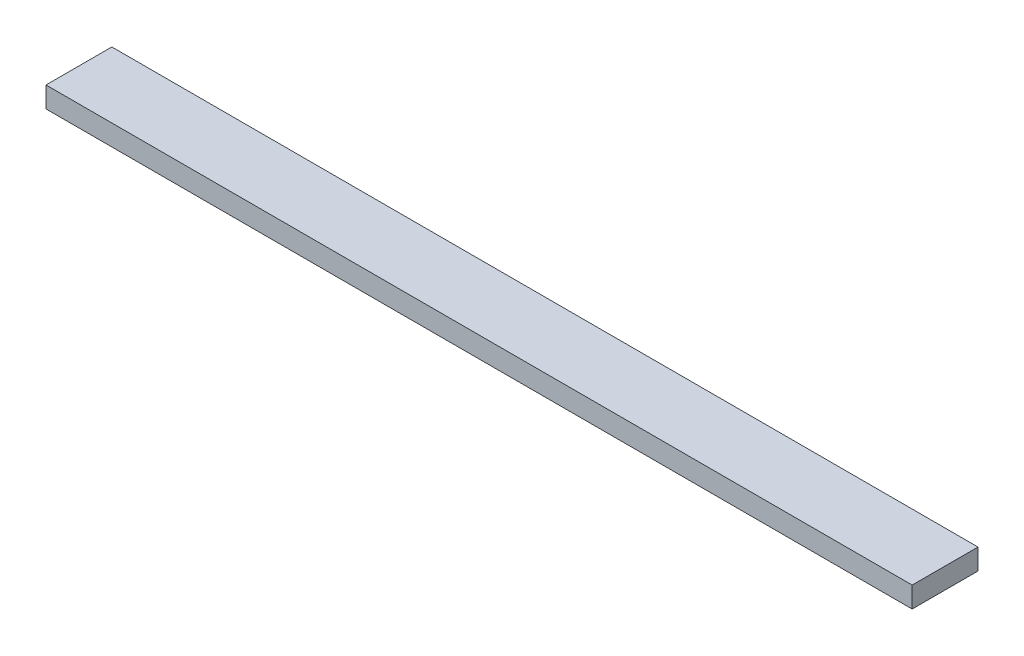
ISO-10303-21;
HEADER;
FILE_DESCRIPTION(('STEP AP214'),'2;1');
FILE_NAME('part.step','',(''),(''),'','','');
FILE_SCHEMA(('AUTOMOTIVE_DESIGN { 1 0 10303 214 1 1 1 1 }'));
ENDSEC;
DATA;
#1=APPLICATION_CONTEXT('core data for automotive mechanical design processes');
#2=APPLICATION_PROTOCOL_DEFINITION('international standard','automotive_design',2000,#1);
#3=PRODUCT_CONTEXT('',#1,'mechanical');
#4=PRODUCT('Part','Part','',(#3));
#5=PRODUCT_RELATED_PRODUCT_CATEGORY('part','',(#4));
#6=PRODUCT_DEFINITION_FORMATION('','',#4);
#7=PRODUCT_DEFINITION_CONTEXT('part definition',#1,'design');
#8=PRODUCT_DEFINITION('design','',#6,#7);
#9=PRODUCT_DEFINITION_SHAPE('','',#8);
#10=(LENGTH_UNIT() NAMED_UNIT(*) SI_UNIT(.MILLI.,.METRE.));
#11=(NAMED_UNIT(*) PLANE_ANGLE_UNIT() SI_UNIT($,.RADIAN.));
#12=(NAMED_UNIT(*) SI_UNIT($,.STERADIAN.) SOLID_ANGLE_UNIT());
#13=UNCERTAINTY_MEASURE_WITH_UNIT(LENGTH_MEASURE(1.E-05),#10,'distance_accuracy_value','');
#14=(GEOMETRIC_REPRESENTATION_CONTEXT(3) GLOBAL_UNCERTAINTY_ASSIGNED_CONTEXT((#13)) GLOBAL_UNIT_ASSIGNED_CONTEXT((#10,
#11,#12)) REPRESENTATION_CONTEXT('',''));
#15=CARTESIAN_POINT('',(0.,0.,0.));
#16=DIRECTION('',(0.,0.,1.));
#17=DIRECTION('',(1.,0.,0.));
#18=AXIS2_PLACEMENT_3D('',#15,#16,#17);
#19=CARTESIAN_POINT('',(-691.829571311172,18.288,43.3638310405165));
#20=DIRECTION('',(1.,0.,0.));
#21=DIRECTION('',(0.,0.,-1.));
#22=AXIS2_PLACEMENT_3D('',#19,#20,#21);
#23=PLANE('',#22);
#24=DIRECTION('',(0.,0.,1.));
#25=VECTOR('',#24,1.);
#26=CARTESIAN_POINT('',(-691.829571311172,0.,43.3638310405165));
#27=LINE('',#26,#25);
#28=CARTESIAN_POINT('',(-691.829571311172,0.,43.3638310405165));
#29=VERTEX_POINT('',#28);
#30=CARTESIAN_POINT('',(-691.829571311172,0.,101.275831040516));
#31=VERTEX_POINT('',#30);
#32=EDGE_CURVE('E98',#29,#31,#27,.T.);
#33=ORIENTED_EDGE('',*,*,#32,.T.);
#34=DIRECTION('',(0.,-1.,0.));
#35=VECTOR('',#34,1.);
#36=CARTESIAN_POINT('',(-691.829571311172,18.288,101.275831040516));
#37=LINE('',#36,#35);
#38=CARTESIAN_POINT('',(-691.829571311172,18.288,101.275831040516));
#39=VERTEX_POINT('',#38);
#40=EDGE_CURVE('E11',#39,#31,#37,.T.);
#41=ORIENTED_EDGE('',*,*,#40,.F.);
#42=DIRECTION('',(0.,0.,1.));
#43=VECTOR('',#42,1.);
#44=CARTESIAN_POINT('',(-691.829571311172,18.288,43.3638310405165));
#45=LINE('',#44,#43);
#46=CARTESIAN_POINT('',(-691.829571311172,18.288,43.3638310405165));
#47=VERTEX_POINT('',#46);
#48=EDGE_CURVE('E86',#47,#39,#45,.T.);
#49=ORIENTED_EDGE('',*,*,#48,.F.);
#50=DIRECTION('',(0.,-1.,0.));
#51=VECTOR('',#50,1.);
#52=CARTESIAN_POINT('',(-691.829571311172,18.288,43.3638310405165));
#53=LINE('',#52,#51);
#54=EDGE_CURVE('E94',#47,#29,#53,.T.);
#55=ORIENTED_EDGE('',*,*,#54,.T.);
#56=EDGE_LOOP('',(#33,#41,#49,#55));
#57=FACE_BOUND('',#56,.T.);
#58=ADVANCED_FACE('F35',(#57),#23,.F.);
#59=CARTESIAN_POINT('',(-691.829571311172,18.288,101.275831040516));
#60=DIRECTION('',(0.,0.,-1.));
#61=DIRECTION('',(-1.,0.,0.));
#62=AXIS2_PLACEMENT_3D('',#59,#60,#61);
#63=PLANE('',#62);
#64=DIRECTION('',(1.,0.,0.));
#65=VECTOR('',#64,1.);
#66=CARTESIAN_POINT('',(-691.829571311172,0.,101.275831040516));
#67=LINE('',#66,#65);
#68=CARTESIAN_POINT('',(70.1704286888285,0.,101.275831040516));
#69=VERTEX_POINT('',#68);
#70=EDGE_CURVE('E90',#31,#69,#67,.T.);
#71=ORIENTED_EDGE('',*,*,#70,.T.);
#72=DIRECTION('',(0.,-1.,0.));
#73=VECTOR('',#72,1.);
#74=CARTESIAN_POINT('',(70.1704286888285,18.288,101.275831040516));
#75=LINE('',#74,#73);
#76=CARTESIAN_POINT('',(70.1704286888285,18.288,101.275831040516));
#77=VERTEX_POINT('',#76);
#78=EDGE_CURVE('E43',#77,#69,#75,.T.);
#79=ORIENTED_EDGE('',*,*,#78,.F.);
#80=DIRECTION('',(1.,0.,0.));
#81=VECTOR('',#80,1.);
#82=CARTESIAN_POINT('',(-691.829571311172,18.288,101.275831040516));
#83=LINE('',#82,#81);
#84=EDGE_CURVE('E81',#39,#77,#83,.T.);
#85=ORIENTED_EDGE('',*,*,#84,.F.);
#86=ORIENTED_EDGE('',*,*,#40,.T.);
#87=EDGE_LOOP('',(#71,#79,#85,#86));
#88=FACE_BOUND('',#87,.T.);
#89=ADVANCED_FACE('F89',(#88),#63,.F.);
#90=CARTESIAN_POINT('',(70.1704286888286,18.288,43.3638310405165));
#91=DIRECTION('',(-1.,0.,0.));
#92=DIRECTION('',(0.,0.,1.));
#93=AXIS2_PLACEMENT_3D('',#90,#91,#92);
#94=PLANE('',#93);
#95=DIRECTION('',(0.,0.,-1.));
#96=VECTOR('',#95,1.);
#97=CARTESIAN_POINT('',(70.1704286888286,0.,43.3638310405165));
#98=LINE('',#97,#96);
#99=CARTESIAN_POINT('',(70.1704286888286,0.,43.3638310405165));
#100=VERTEX_POINT('',#99);
#101=EDGE_CURVE('E68',#69,#100,#98,.T.);
#102=ORIENTED_EDGE('',*,*,#101,.T.);
#103=DIRECTION('',(0.,-1.,0.));
#104=VECTOR('',#103,1.);
#105=CARTESIAN_POINT('',(70.1704286888286,18.288,43.3638310405165));
#106=LINE('',#105,#104);
#107=CARTESIAN_POINT('',(70.1704286888286,18.288,43.3638310405165));
#108=VERTEX_POINT('',#107);
#109=EDGE_CURVE('E91',#108,#100,#106,.T.);
#110=ORIENTED_EDGE('',*,*,#109,.F.);
#111=DIRECTION('',(0.,0.,-1.));
#112=VECTOR('',#111,1.);
#113=CARTESIAN_POINT('',(70.1704286888286,18.288,43.3638310405165));
#114=LINE('',#113,#112);
#115=EDGE_CURVE('E84',#77,#108,#114,.T.);
#116=ORIENTED_EDGE('',*,*,#115,.F.);
#117=ORIENTED_EDGE('',*,*,#78,.T.);
#118=EDGE_LOOP('',(#102,#110,#116,#117));
#119=FACE_BOUND('',#118,.T.);
#120=ADVANCED_FACE('F92',(#119),#94,.F.);
#121=CARTESIAN_POINT('',(-691.829571311172,18.288,43.3638310405165));
#122=DIRECTION('',(0.,0.,1.));
#123=DIRECTION('',(1.,0.,0.));
#124=AXIS2_PLACEMENT_3D('',#121,#122,#123);
#125=PLANE('',#124);
#126=DIRECTION('',(-1.,0.,0.));
#127=VECTOR('',#126,1.);
#128=CARTESIAN_POINT('',(-691.829571311172,0.,43.3638310405165));
#129=LINE('',#128,#127);
#130=EDGE_CURVE('E74',#100,#29,#129,.T.);
#131=ORIENTED_EDGE('',*,*,#130,.T.);
#132=ORIENTED_EDGE('',*,*,#54,.F.);
#133=DIRECTION('',(-1.,0.,0.));
#134=VECTOR('',#133,1.);
#135=CARTESIAN_POINT('',(-691.829571311172,18.288,43.3638310405165));
#136=LINE('',#135,#134);
#137=EDGE_CURVE('E51',#108,#47,#136,.T.);
#138=ORIENTED_EDGE('',*,*,#137,.F.);
#139=ORIENTED_EDGE('',*,*,#109,.T.);
#140=EDGE_LOOP('',(#131,#132,#138,#139));
#141=FACE_BOUND('',#140,.T.);
#142=ADVANCED_FACE('F105',(#141),#125,.F.);
#143=CARTESIAN_POINT('',(0.,18.288,0.));
#144=DIRECTION('',(0.,1.,0.));
#145=DIRECTION('',(0.,0.,1.));
#146=AXIS2_PLACEMENT_3D('',#143,#144,#145);
#147=PLANE('',#146);
#148=ORIENTED_EDGE('',*,*,#48,.T.);
#149=ORIENTED_EDGE('',*,*,#84,.T.);
#150=ORIENTED_EDGE('',*,*,#115,.T.);
#151=ORIENTED_EDGE('',*,*,#137,.T.);
#152=EDGE_LOOP('',(#148,#149,#150,#151));
#153=FACE_BOUND('',#152,.T.);
#154=ADVANCED_FACE('F82',(#153),#147,.T.);
#155=CARTESIAN_POINT('',(0.,0.,0.));
#156=DIRECTION('',(0.,1.,0.));
#157=DIRECTION('',(0.,0.,1.));
#158=AXIS2_PLACEMENT_3D('',#155,#156,#157);
#159=PLANE('',#158);
#160=ORIENTED_EDGE('',*,*,#32,.F.);
#161=ORIENTED_EDGE('',*,*,#130,.F.);
#162=ORIENTED_EDGE('',*,*,#101,.F.);
#163=ORIENTED_EDGE('',*,*,#70,.F.);
#164=EDGE_LOOP('',(#160,#161,#162,#163));
#165=FACE_BOUND('',#164,.T.);
#166=ADVANCED_FACE('F108',(#165),#159,.F.);
#167=CLOSED_SHELL('',(#58,#89,#120,#142,#154,#166));
#168=MANIFOLD_SOLID_BREP('B2',#167);
#169=ADVANCED_BREP_SHAPE_REPRESENTATION('',(#18,#168),#14);
#170=SHAPE_DEFINITION_REPRESENTATION(#9,#169);
ENDSEC;
END-ISO-10303-21;
